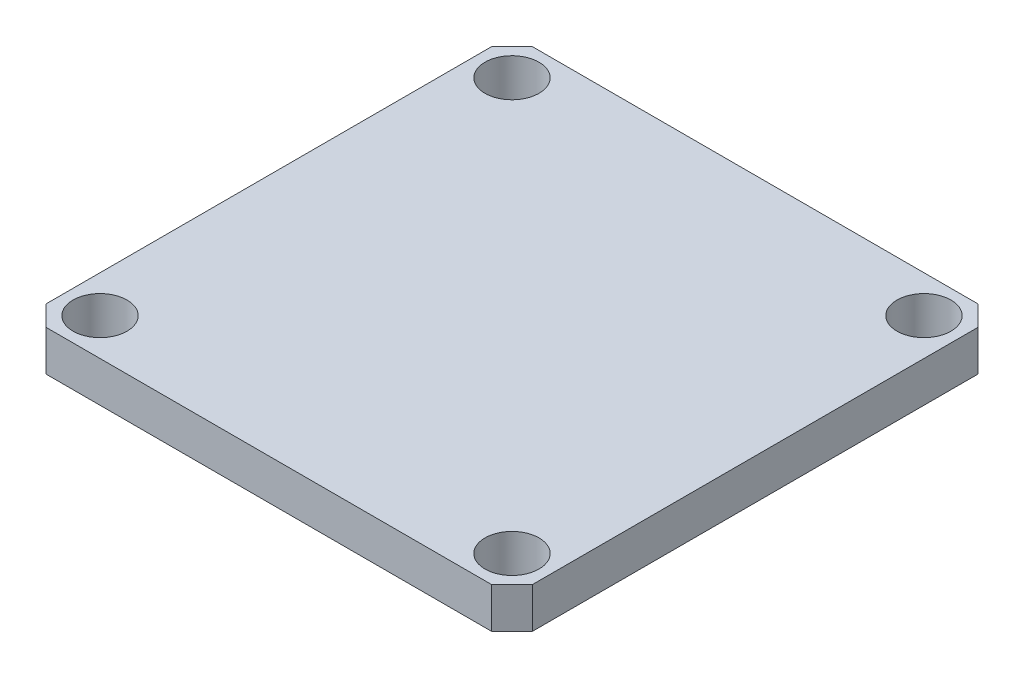
ISO-10303-21;
HEADER;
FILE_DESCRIPTION(('STEP AP214'),'2;1');
FILE_NAME('part.step','',(''),(''),'','','');
FILE_SCHEMA(('AUTOMOTIVE_DESIGN { 1 0 10303 214 1 1 1 1 }'));
ENDSEC;
DATA;
#1=APPLICATION_CONTEXT('core data for automotive mechanical design processes');
#2=APPLICATION_PROTOCOL_DEFINITION('international standard','automotive_design',2000,#1);
#3=PRODUCT_CONTEXT('',#1,'mechanical');
#4=PRODUCT('Part','Part','',(#3));
#5=PRODUCT_RELATED_PRODUCT_CATEGORY('part','',(#4));
#6=PRODUCT_DEFINITION_FORMATION('','',#4);
#7=PRODUCT_DEFINITION_CONTEXT('part definition',#1,'design');
#8=PRODUCT_DEFINITION('design','',#6,#7);
#9=PRODUCT_DEFINITION_SHAPE('','',#8);
#10=(LENGTH_UNIT() NAMED_UNIT(*) SI_UNIT(.MILLI.,.METRE.));
#11=(NAMED_UNIT(*) PLANE_ANGLE_UNIT() SI_UNIT($,.RADIAN.));
#12=(NAMED_UNIT(*) SI_UNIT($,.STERADIAN.) SOLID_ANGLE_UNIT());
#13=UNCERTAINTY_MEASURE_WITH_UNIT(LENGTH_MEASURE(1.E-05),#10,'distance_accuracy_value','');
#14=(GEOMETRIC_REPRESENTATION_CONTEXT(3) GLOBAL_UNCERTAINTY_ASSIGNED_CONTEXT((#13)) GLOBAL_UNIT_ASSIGNED_CONTEXT((#10,
#11,#12)) REPRESENTATION_CONTEXT('',''));
#15=CARTESIAN_POINT('',(0.,0.,0.));
#16=DIRECTION('',(0.,0.,1.));
#17=DIRECTION('',(1.,0.,0.));
#18=AXIS2_PLACEMENT_3D('',#15,#16,#17);
#19=CARTESIAN_POINT('',(0.,3.,0.));
#20=DIRECTION('',(0.,1.,0.));
#21=DIRECTION('',(0.,0.,1.));
#22=AXIS2_PLACEMENT_3D('',#19,#20,#21);
#23=PLANE('',#22);
#24=CARTESIAN_POINT('',(15.25,3.,15.25));
#25=DIRECTION('',(0.,1.,0.));
#26=DIRECTION('',(0.,0.,-1.));
#27=AXIS2_PLACEMENT_3D('',#24,#25,#26);
#28=CIRCLE('',#27,2.);
#29=CARTESIAN_POINT('',(15.25,3.,13.25));
#30=VERTEX_POINT('',#29);
#31=EDGE_CURVE('E196',#30,#30,#28,.T.);
#32=ORIENTED_EDGE('',*,*,#31,.F.);
#33=EDGE_LOOP('',(#32));
#34=FACE_BOUND('',#33,.T.);
#35=CARTESIAN_POINT('',(15.25,3.,-15.25));
#36=DIRECTION('',(0.,1.,0.));
#37=DIRECTION('',(0.,0.,1.));
#38=AXIS2_PLACEMENT_3D('',#35,#36,#37);
#39=CIRCLE('',#38,2.);
#40=CARTESIAN_POINT('',(15.25,3.,-13.25));
#41=VERTEX_POINT('',#40);
#42=EDGE_CURVE('E142',#41,#41,#39,.T.);
#43=ORIENTED_EDGE('',*,*,#42,.F.);
#44=EDGE_LOOP('',(#43));
#45=FACE_BOUND('',#44,.T.);
#46=DIRECTION('',(0.707106781186547,0.,0.707106781186547));
#47=VECTOR('',#46,1.);
#48=CARTESIAN_POINT('',(-18.,3.,16.5));
#49=LINE('',#48,#47);
#50=CARTESIAN_POINT('',(-18.,3.,16.5));
#51=VERTEX_POINT('',#50);
#52=CARTESIAN_POINT('',(-16.5,3.,18.));
#53=VERTEX_POINT('',#52);
#54=EDGE_CURVE('E153',#51,#53,#49,.T.);
#55=ORIENTED_EDGE('',*,*,#54,.T.);
#56=DIRECTION('',(1.,0.,0.));
#57=VECTOR('',#56,1.);
#58=CARTESIAN_POINT('',(-16.5,3.,18.));
#59=LINE('',#58,#57);
#60=CARTESIAN_POINT('',(16.5,3.,18.));
#61=VERTEX_POINT('',#60);
#62=EDGE_CURVE('E101',#53,#61,#59,.T.);
#63=ORIENTED_EDGE('',*,*,#62,.T.);
#64=DIRECTION('',(0.707106781186547,0.,-0.707106781186547));
#65=VECTOR('',#64,1.);
#66=CARTESIAN_POINT('',(16.5,3.,18.));
#67=LINE('',#66,#65);
#68=CARTESIAN_POINT('',(18.,3.,16.5));
#69=VERTEX_POINT('',#68);
#70=EDGE_CURVE('E168',#61,#69,#67,.T.);
#71=ORIENTED_EDGE('',*,*,#70,.T.);
#72=DIRECTION('',(0.,0.,-1.));
#73=VECTOR('',#72,1.);
#74=CARTESIAN_POINT('',(18.,3.,16.5));
#75=LINE('',#74,#73);
#76=CARTESIAN_POINT('',(18.,3.,-16.5));
#77=VERTEX_POINT('',#76);
#78=EDGE_CURVE('E181',#69,#77,#75,.T.);
#79=ORIENTED_EDGE('',*,*,#78,.T.);
#80=DIRECTION('',(-0.707106781186547,0.,-0.707106781186547));
#81=VECTOR('',#80,1.);
#82=CARTESIAN_POINT('',(18.,3.,-16.5));
#83=LINE('',#82,#81);
#84=CARTESIAN_POINT('',(16.5,3.,-18.));
#85=VERTEX_POINT('',#84);
#86=EDGE_CURVE('E120',#77,#85,#83,.T.);
#87=ORIENTED_EDGE('',*,*,#86,.T.);
#88=DIRECTION('',(-1.,0.,0.));
#89=VECTOR('',#88,1.);
#90=CARTESIAN_POINT('',(16.5,3.,-18.));
#91=LINE('',#90,#89);
#92=CARTESIAN_POINT('',(-16.5,3.,-18.));
#93=VERTEX_POINT('',#92);
#94=EDGE_CURVE('E114',#85,#93,#91,.T.);
#95=ORIENTED_EDGE('',*,*,#94,.T.);
#96=DIRECTION('',(-0.707106781186547,0.,0.707106781186547));
#97=VECTOR('',#96,1.);
#98=CARTESIAN_POINT('',(-16.5,3.,-18.));
#99=LINE('',#98,#97);
#100=CARTESIAN_POINT('',(-18.,3.,-16.5));
#101=VERTEX_POINT('',#100);
#102=EDGE_CURVE('E118',#93,#101,#99,.T.);
#103=ORIENTED_EDGE('',*,*,#102,.T.);
#104=DIRECTION('',(0.,0.,1.));
#105=VECTOR('',#104,1.);
#106=CARTESIAN_POINT('',(-18.,3.,-16.5));
#107=LINE('',#106,#105);
#108=EDGE_CURVE('E58',#101,#51,#107,.T.);
#109=ORIENTED_EDGE('',*,*,#108,.T.);
#110=EDGE_LOOP('',(#55,#63,#71,#79,#87,#95,#103,#109));
#111=FACE_BOUND('',#110,.T.);
#112=CARTESIAN_POINT('',(-15.25,3.,-15.25));
#113=DIRECTION('',(0.,1.,0.));
#114=DIRECTION('',(0.,0.,-1.));
#115=AXIS2_PLACEMENT_3D('',#112,#113,#114);
#116=CIRCLE('',#115,2.);
#117=CARTESIAN_POINT('',(-15.25,3.,-17.25));
#118=VERTEX_POINT('',#117);
#119=EDGE_CURVE('E190',#118,#118,#116,.T.);
#120=ORIENTED_EDGE('',*,*,#119,.F.);
#121=EDGE_LOOP('',(#120));
#122=FACE_BOUND('',#121,.T.);
#123=CARTESIAN_POINT('',(-15.25,3.,15.25));
#124=DIRECTION('',(0.,1.,0.));
#125=DIRECTION('',(0.,0.,1.));
#126=AXIS2_PLACEMENT_3D('',#123,#124,#125);
#127=CIRCLE('',#126,2.);
#128=CARTESIAN_POINT('',(-15.25,3.,17.25));
#129=VERTEX_POINT('',#128);
#130=EDGE_CURVE('E202',#129,#129,#127,.T.);
#131=ORIENTED_EDGE('',*,*,#130,.F.);
#132=EDGE_LOOP('',(#131));
#133=FACE_BOUND('',#132,.T.);
#134=ADVANCED_FACE('F41',(#34,#45,#111,#122,#133),#23,.T.);
#135=CARTESIAN_POINT('',(0.,0.,0.));
#136=DIRECTION('',(0.,1.,0.));
#137=DIRECTION('',(0.,0.,1.));
#138=AXIS2_PLACEMENT_3D('',#135,#136,#137);
#139=PLANE('',#138);
#140=DIRECTION('',(0.707106781186547,0.,0.707106781186547));
#141=VECTOR('',#140,1.);
#142=CARTESIAN_POINT('',(-18.,0.,16.5));
#143=LINE('',#142,#141);
#144=CARTESIAN_POINT('',(-18.,0.,16.5));
#145=VERTEX_POINT('',#144);
#146=CARTESIAN_POINT('',(-16.5,0.,18.));
#147=VERTEX_POINT('',#146);
#148=EDGE_CURVE('E138',#145,#147,#143,.T.);
#149=ORIENTED_EDGE('',*,*,#148,.F.);
#150=DIRECTION('',(0.,0.,1.));
#151=VECTOR('',#150,1.);
#152=CARTESIAN_POINT('',(-18.,0.,-16.5));
#153=LINE('',#152,#151);
#154=CARTESIAN_POINT('',(-18.,0.,-16.5));
#155=VERTEX_POINT('',#154);
#156=EDGE_CURVE('E93',#155,#145,#153,.T.);
#157=ORIENTED_EDGE('',*,*,#156,.F.);
#158=DIRECTION('',(-0.707106781186547,0.,0.707106781186547));
#159=VECTOR('',#158,1.);
#160=CARTESIAN_POINT('',(-16.5,0.,-18.));
#161=LINE('',#160,#159);
#162=CARTESIAN_POINT('',(-16.5,0.,-18.));
#163=VERTEX_POINT('',#162);
#164=EDGE_CURVE('E87',#163,#155,#161,.T.);
#165=ORIENTED_EDGE('',*,*,#164,.F.);
#166=DIRECTION('',(-1.,0.,0.));
#167=VECTOR('',#166,1.);
#168=CARTESIAN_POINT('',(16.5,0.,-18.));
#169=LINE('',#168,#167);
#170=CARTESIAN_POINT('',(16.5,0.,-18.));
#171=VERTEX_POINT('',#170);
#172=EDGE_CURVE('E128',#171,#163,#169,.T.);
#173=ORIENTED_EDGE('',*,*,#172,.F.);
#174=DIRECTION('',(-0.707106781186547,0.,-0.707106781186547));
#175=VECTOR('',#174,1.);
#176=CARTESIAN_POINT('',(18.,0.,-16.5));
#177=LINE('',#176,#175);
#178=CARTESIAN_POINT('',(18.,0.,-16.5));
#179=VERTEX_POINT('',#178);
#180=EDGE_CURVE('E148',#179,#171,#177,.T.);
#181=ORIENTED_EDGE('',*,*,#180,.F.);
#182=DIRECTION('',(0.,0.,-1.));
#183=VECTOR('',#182,1.);
#184=CARTESIAN_POINT('',(18.,0.,16.5));
#185=LINE('',#184,#183);
#186=CARTESIAN_POINT('',(18.,0.,16.5));
#187=VERTEX_POINT('',#186);
#188=EDGE_CURVE('E146',#187,#179,#185,.T.);
#189=ORIENTED_EDGE('',*,*,#188,.F.);
#190=DIRECTION('',(0.707106781186547,0.,-0.707106781186547));
#191=VECTOR('',#190,1.);
#192=CARTESIAN_POINT('',(16.5,0.,18.));
#193=LINE('',#192,#191);
#194=CARTESIAN_POINT('',(16.5,0.,18.));
#195=VERTEX_POINT('',#194);
#196=EDGE_CURVE('E144',#195,#187,#193,.T.);
#197=ORIENTED_EDGE('',*,*,#196,.F.);
#198=DIRECTION('',(1.,0.,0.));
#199=VECTOR('',#198,1.);
#200=CARTESIAN_POINT('',(-16.5,0.,18.));
#201=LINE('',#200,#199);
#202=EDGE_CURVE('E141',#147,#195,#201,.T.);
#203=ORIENTED_EDGE('',*,*,#202,.F.);
#204=EDGE_LOOP('',(#149,#157,#165,#173,#181,#189,#197,#203));
#205=FACE_BOUND('',#204,.T.);
#206=CARTESIAN_POINT('',(15.25,0.,-15.25));
#207=DIRECTION('',(0.,1.,0.));
#208=DIRECTION('',(0.,0.,1.));
#209=AXIS2_PLACEMENT_3D('',#206,#207,#208);
#210=CIRCLE('',#209,2.);
#211=CARTESIAN_POINT('',(15.25,0.,-13.25));
#212=VERTEX_POINT('',#211);
#213=EDGE_CURVE('E187',#212,#212,#210,.T.);
#214=ORIENTED_EDGE('',*,*,#213,.T.);
#215=EDGE_LOOP('',(#214));
#216=FACE_BOUND('',#215,.T.);
#217=CARTESIAN_POINT('',(-15.25,0.,-15.25));
#218=DIRECTION('',(0.,1.,0.));
#219=DIRECTION('',(0.,0.,-1.));
#220=AXIS2_PLACEMENT_3D('',#217,#218,#219);
#221=CIRCLE('',#220,2.);
#222=CARTESIAN_POINT('',(-15.25,0.,-17.25));
#223=VERTEX_POINT('',#222);
#224=EDGE_CURVE('E193',#223,#223,#221,.T.);
#225=ORIENTED_EDGE('',*,*,#224,.T.);
#226=EDGE_LOOP('',(#225));
#227=FACE_BOUND('',#226,.T.);
#228=CARTESIAN_POINT('',(15.25,0.,15.25));
#229=DIRECTION('',(0.,1.,0.));
#230=DIRECTION('',(0.,0.,-1.));
#231=AXIS2_PLACEMENT_3D('',#228,#229,#230);
#232=CIRCLE('',#231,2.);
#233=CARTESIAN_POINT('',(15.25,0.,13.25));
#234=VERTEX_POINT('',#233);
#235=EDGE_CURVE('E199',#234,#234,#232,.T.);
#236=ORIENTED_EDGE('',*,*,#235,.T.);
#237=EDGE_LOOP('',(#236));
#238=FACE_BOUND('',#237,.T.);
#239=CARTESIAN_POINT('',(-15.25,0.,15.25));
#240=DIRECTION('',(0.,1.,0.));
#241=DIRECTION('',(0.,0.,1.));
#242=AXIS2_PLACEMENT_3D('',#239,#240,#241);
#243=CIRCLE('',#242,2.);
#244=CARTESIAN_POINT('',(-15.25,0.,17.25));
#245=VERTEX_POINT('',#244);
#246=EDGE_CURVE('E205',#245,#245,#243,.T.);
#247=ORIENTED_EDGE('',*,*,#246,.T.);
#248=EDGE_LOOP('',(#247));
#249=FACE_BOUND('',#248,.T.);
#250=ADVANCED_FACE('F172',(#205,#216,#227,#238,#249),#139,.F.);
#251=CARTESIAN_POINT('',(-18.,3.,16.5));
#252=DIRECTION('',(0.707106781186548,0.,-0.707106781186548));
#253=DIRECTION('',(-0.707106781186548,0.,-0.707106781186548));
#254=AXIS2_PLACEMENT_3D('',#251,#252,#253);
#255=PLANE('',#254);
#256=ORIENTED_EDGE('',*,*,#148,.T.);
#257=DIRECTION('',(0.,-1.,0.));
#258=VECTOR('',#257,1.);
#259=CARTESIAN_POINT('',(-16.5,3.,18.));
#260=LINE('',#259,#258);
#261=EDGE_CURVE('E11',#53,#147,#260,.T.);
#262=ORIENTED_EDGE('',*,*,#261,.F.);
#263=ORIENTED_EDGE('',*,*,#54,.F.);
#264=DIRECTION('',(0.,-1.,0.));
#265=VECTOR('',#264,1.);
#266=CARTESIAN_POINT('',(-18.,3.,16.5));
#267=LINE('',#266,#265);
#268=EDGE_CURVE('E134',#51,#145,#267,.T.);
#269=ORIENTED_EDGE('',*,*,#268,.T.);
#270=EDGE_LOOP('',(#256,#262,#263,#269));
#271=FACE_BOUND('',#270,.T.);
#272=ADVANCED_FACE('F43',(#271),#255,.F.);
#273=CARTESIAN_POINT('',(-16.5,3.,18.));
#274=DIRECTION('',(0.,0.,-1.));
#275=DIRECTION('',(-1.,0.,0.));
#276=AXIS2_PLACEMENT_3D('',#273,#274,#275);
#277=PLANE('',#276);
#278=ORIENTED_EDGE('',*,*,#202,.T.);
#279=DIRECTION('',(0.,-1.,0.));
#280=VECTOR('',#279,1.);
#281=CARTESIAN_POINT('',(16.5,3.,18.));
#282=LINE('',#281,#280);
#283=EDGE_CURVE('E50',#61,#195,#282,.T.);
#284=ORIENTED_EDGE('',*,*,#283,.F.);
#285=ORIENTED_EDGE('',*,*,#62,.F.);
#286=ORIENTED_EDGE('',*,*,#261,.T.);
#287=EDGE_LOOP('',(#278,#284,#285,#286));
#288=FACE_BOUND('',#287,.T.);
#289=ADVANCED_FACE('F239',(#288),#277,.F.);
#290=CARTESIAN_POINT('',(16.5,3.,18.));
#291=DIRECTION('',(-0.707106781186548,0.,-0.707106781186548));
#292=DIRECTION('',(-0.707106781186548,0.,0.707106781186548));
#293=AXIS2_PLACEMENT_3D('',#290,#291,#292);
#294=PLANE('',#293);
#295=ORIENTED_EDGE('',*,*,#196,.T.);
#296=DIRECTION('',(0.,-1.,0.));
#297=VECTOR('',#296,1.);
#298=CARTESIAN_POINT('',(18.,3.,16.5));
#299=LINE('',#298,#297);
#300=EDGE_CURVE('E160',#69,#187,#299,.T.);
#301=ORIENTED_EDGE('',*,*,#300,.F.);
#302=ORIENTED_EDGE('',*,*,#70,.F.);
#303=ORIENTED_EDGE('',*,*,#283,.T.);
#304=EDGE_LOOP('',(#295,#301,#302,#303));
#305=FACE_BOUND('',#304,.T.);
#306=ADVANCED_FACE('F166',(#305),#294,.F.);
#307=CARTESIAN_POINT('',(18.,3.,16.5));
#308=DIRECTION('',(-1.,0.,0.));
#309=DIRECTION('',(0.,0.,1.));
#310=AXIS2_PLACEMENT_3D('',#307,#308,#309);
#311=PLANE('',#310);
#312=ORIENTED_EDGE('',*,*,#188,.T.);
#313=DIRECTION('',(0.,-1.,0.));
#314=VECTOR('',#313,1.);
#315=CARTESIAN_POINT('',(18.,3.,-16.5));
#316=LINE('',#315,#314);
#317=EDGE_CURVE('E157',#77,#179,#316,.T.);
#318=ORIENTED_EDGE('',*,*,#317,.F.);
#319=ORIENTED_EDGE('',*,*,#78,.F.);
#320=ORIENTED_EDGE('',*,*,#300,.T.);
#321=EDGE_LOOP('',(#312,#318,#319,#320));
#322=FACE_BOUND('',#321,.T.);
#323=ADVANCED_FACE('F177',(#322),#311,.F.);
#324=CARTESIAN_POINT('',(18.,3.,-16.5));
#325=DIRECTION('',(-0.707106781186548,0.,0.707106781186548));
#326=DIRECTION('',(0.707106781186548,0.,0.707106781186548));
#327=AXIS2_PLACEMENT_3D('',#324,#325,#326);
#328=PLANE('',#327);
#329=ORIENTED_EDGE('',*,*,#180,.T.);
#330=DIRECTION('',(0.,-1.,0.));
#331=VECTOR('',#330,1.);
#332=CARTESIAN_POINT('',(16.5,3.,-18.));
#333=LINE('',#332,#331);
#334=EDGE_CURVE('E129',#85,#171,#333,.T.);
#335=ORIENTED_EDGE('',*,*,#334,.F.);
#336=ORIENTED_EDGE('',*,*,#86,.F.);
#337=ORIENTED_EDGE('',*,*,#317,.T.);
#338=EDGE_LOOP('',(#329,#335,#336,#337));
#339=FACE_BOUND('',#338,.T.);
#340=ADVANCED_FACE('F180',(#339),#328,.F.);
#341=CARTESIAN_POINT('',(16.5,3.,-18.));
#342=DIRECTION('',(0.,0.,1.));
#343=DIRECTION('',(1.,0.,0.));
#344=AXIS2_PLACEMENT_3D('',#341,#342,#343);
#345=PLANE('',#344);
#346=ORIENTED_EDGE('',*,*,#172,.T.);
#347=DIRECTION('',(0.,-1.,0.));
#348=VECTOR('',#347,1.);
#349=CARTESIAN_POINT('',(-16.5,3.,-18.));
#350=LINE('',#349,#348);
#351=EDGE_CURVE('E125',#93,#163,#350,.T.);
#352=ORIENTED_EDGE('',*,*,#351,.F.);
#353=ORIENTED_EDGE('',*,*,#94,.F.);
#354=ORIENTED_EDGE('',*,*,#334,.T.);
#355=EDGE_LOOP('',(#346,#352,#353,#354));
#356=FACE_BOUND('',#355,.T.);
#357=ADVANCED_FACE('F126',(#356),#345,.F.);
#358=CARTESIAN_POINT('',(-16.5,3.,-18.));
#359=DIRECTION('',(0.707106781186548,0.,0.707106781186548));
#360=DIRECTION('',(0.707106781186548,0.,-0.707106781186548));
#361=AXIS2_PLACEMENT_3D('',#358,#359,#360);
#362=PLANE('',#361);
#363=ORIENTED_EDGE('',*,*,#164,.T.);
#364=DIRECTION('',(0.,-1.,0.));
#365=VECTOR('',#364,1.);
#366=CARTESIAN_POINT('',(-18.,3.,-16.5));
#367=LINE('',#366,#365);
#368=EDGE_CURVE('E130',#101,#155,#367,.T.);
#369=ORIENTED_EDGE('',*,*,#368,.F.);
#370=ORIENTED_EDGE('',*,*,#102,.F.);
#371=ORIENTED_EDGE('',*,*,#351,.T.);
#372=EDGE_LOOP('',(#363,#369,#370,#371));
#373=FACE_BOUND('',#372,.T.);
#374=ADVANCED_FACE('F132',(#373),#362,.F.);
#375=CARTESIAN_POINT('',(-18.,3.,-16.5));
#376=DIRECTION('',(1.,0.,0.));
#377=DIRECTION('',(0.,0.,-1.));
#378=AXIS2_PLACEMENT_3D('',#375,#376,#377);
#379=PLANE('',#378);
#380=ORIENTED_EDGE('',*,*,#156,.T.);
#381=ORIENTED_EDGE('',*,*,#268,.F.);
#382=ORIENTED_EDGE('',*,*,#108,.F.);
#383=ORIENTED_EDGE('',*,*,#368,.T.);
#384=EDGE_LOOP('',(#380,#381,#382,#383));
#385=FACE_BOUND('',#384,.T.);
#386=ADVANCED_FACE('F227',(#385),#379,.F.);
#387=CARTESIAN_POINT('',(15.25,3.,-15.25));
#388=DIRECTION('',(0.,-1.,0.));
#389=DIRECTION('',(0.,0.,-1.));
#390=AXIS2_PLACEMENT_3D('',#387,#388,#389);
#391=CYLINDRICAL_SURFACE('',#390,2.);
#392=ORIENTED_EDGE('',*,*,#42,.T.);
#393=EDGE_LOOP('',(#392));
#394=FACE_BOUND('',#393,.T.);
#395=ORIENTED_EDGE('',*,*,#213,.F.);
#396=EDGE_LOOP('',(#395));
#397=FACE_BOUND('',#396,.T.);
#398=ADVANCED_FACE('F224',(#394,#397),#391,.F.);
#399=CARTESIAN_POINT('',(-15.25,3.,-15.25));
#400=DIRECTION('',(0.,-1.,0.));
#401=DIRECTION('',(0.,0.,-1.));
#402=AXIS2_PLACEMENT_3D('',#399,#400,#401);
#403=CYLINDRICAL_SURFACE('',#402,2.);
#404=ORIENTED_EDGE('',*,*,#119,.T.);
#405=EDGE_LOOP('',(#404));
#406=FACE_BOUND('',#405,.T.);
#407=ORIENTED_EDGE('',*,*,#224,.F.);
#408=EDGE_LOOP('',(#407));
#409=FACE_BOUND('',#408,.T.);
#410=ADVANCED_FACE('F302',(#406,#409),#403,.F.);
#411=CARTESIAN_POINT('',(15.25,3.,15.25));
#412=DIRECTION('',(0.,-1.,0.));
#413=DIRECTION('',(0.,0.,-1.));
#414=AXIS2_PLACEMENT_3D('',#411,#412,#413);
#415=CYLINDRICAL_SURFACE('',#414,2.);
#416=ORIENTED_EDGE('',*,*,#31,.T.);
#417=EDGE_LOOP('',(#416));
#418=FACE_BOUND('',#417,.T.);
#419=ORIENTED_EDGE('',*,*,#235,.F.);
#420=EDGE_LOOP('',(#419));
#421=FACE_BOUND('',#420,.T.);
#422=ADVANCED_FACE('F310',(#418,#421),#415,.F.);
#423=CARTESIAN_POINT('',(-15.25,3.,15.25));
#424=DIRECTION('',(0.,-1.,0.));
#425=DIRECTION('',(0.,0.,-1.));
#426=AXIS2_PLACEMENT_3D('',#423,#424,#425);
#427=CYLINDRICAL_SURFACE('',#426,2.);
#428=ORIENTED_EDGE('',*,*,#130,.T.);
#429=EDGE_LOOP('',(#428));
#430=FACE_BOUND('',#429,.T.);
#431=ORIENTED_EDGE('',*,*,#246,.F.);
#432=EDGE_LOOP('',(#431));
#433=FACE_BOUND('',#432,.T.);
#434=ADVANCED_FACE('F211',(#430,#433),#427,.F.);
#435=CLOSED_SHELL('',(#134,#250,#272,#289,#306,#323,#340,#357,#374,#386,#398,#410,#422,#434));
#436=MANIFOLD_SOLID_BREP('B2',#435);
#437=ADVANCED_BREP_SHAPE_REPRESENTATION('',(#18,#436),#14);
#438=SHAPE_DEFINITION_REPRESENTATION(#9,#437);
ENDSEC;
END-ISO-10303-21;
